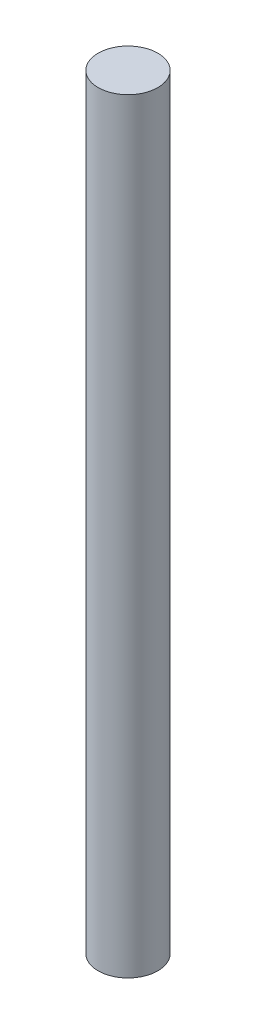
ISO-10303-21;
HEADER;
FILE_DESCRIPTION(('STEP AP214'),'2;1');
FILE_NAME('part.step','',(''),(''),'','','');
FILE_SCHEMA(('AUTOMOTIVE_DESIGN { 1 0 10303 214 1 1 1 1 }'));
ENDSEC;
DATA;
#1=APPLICATION_CONTEXT('core data for automotive mechanical design processes');
#2=APPLICATION_PROTOCOL_DEFINITION('international standard','automotive_design',2000,#1);
#3=PRODUCT_CONTEXT('',#1,'mechanical');
#4=PRODUCT('Part','Part','',(#3));
#5=PRODUCT_RELATED_PRODUCT_CATEGORY('part','',(#4));
#6=PRODUCT_DEFINITION_FORMATION('','',#4);
#7=PRODUCT_DEFINITION_CONTEXT('part definition',#1,'design');
#8=PRODUCT_DEFINITION('design','',#6,#7);
#9=PRODUCT_DEFINITION_SHAPE('','',#8);
#10=(LENGTH_UNIT() NAMED_UNIT(*) SI_UNIT(.MILLI.,.METRE.));
#11=(NAMED_UNIT(*) PLANE_ANGLE_UNIT() SI_UNIT($,.RADIAN.));
#12=(NAMED_UNIT(*) SI_UNIT($,.STERADIAN.) SOLID_ANGLE_UNIT());
#13=UNCERTAINTY_MEASURE_WITH_UNIT(LENGTH_MEASURE(1.E-05),#10,'distance_accuracy_value','');
#14=(GEOMETRIC_REPRESENTATION_CONTEXT(3) GLOBAL_UNCERTAINTY_ASSIGNED_CONTEXT((#13)) GLOBAL_UNIT_ASSIGNED_CONTEXT((#10,
#11,#12)) REPRESENTATION_CONTEXT('',''));
#15=CARTESIAN_POINT('',(0.,0.,0.));
#16=DIRECTION('',(0.,0.,1.));
#17=DIRECTION('',(1.,0.,0.));
#18=AXIS2_PLACEMENT_3D('',#15,#16,#17);
#19=CARTESIAN_POINT('',(1750.0000800792,-25025.,1750.00010455724));
#20=DIRECTION('',(0.,1.,0.));
#21=DIRECTION('',(0.,0.,1.));
#22=AXIS2_PLACEMENT_3D('',#19,#20,#21);
#23=CYLINDRICAL_SURFACE('',#22,1.95);
#24=CARTESIAN_POINT('',(1750.0000800792,-25025.,1750.00010455724));
#25=DIRECTION('',(0.,1.,0.));
#26=DIRECTION('',(0.,0.,1.));
#27=AXIS2_PLACEMENT_3D('',#24,#25,#26);
#28=CIRCLE('',#27,1.95);
#29=CARTESIAN_POINT('',(1750.0000800792,-25025.,1751.95010455724));
#30=VERTEX_POINT('',#29);
#31=EDGE_CURVE('E10',#30,#30,#28,.T.);
#32=ORIENTED_EDGE('',*,*,#31,.T.);
#33=EDGE_LOOP('',(#32));
#34=FACE_BOUND('',#33,.T.);
#35=CARTESIAN_POINT('',(1750.0000800792,-24975.,1750.00010455724));
#36=DIRECTION('',(0.,1.,0.));
#37=DIRECTION('',(0.,0.,1.));
#38=AXIS2_PLACEMENT_3D('',#35,#36,#37);
#39=CIRCLE('',#38,1.95);
#40=CARTESIAN_POINT('',(1750.0000800792,-24975.,1751.95010455724));
#41=VERTEX_POINT('',#40);
#42=EDGE_CURVE('E42',#41,#41,#39,.T.);
#43=ORIENTED_EDGE('',*,*,#42,.F.);
#44=EDGE_LOOP('',(#43));
#45=FACE_BOUND('',#44,.T.);
#46=ADVANCED_FACE('F39',(#34,#45),#23,.T.);
#47=CARTESIAN_POINT('',(1750.0000800792,-25025.,1750.00010455724));
#48=DIRECTION('',(0.,1.,0.));
#49=DIRECTION('',(0.,0.,1.));
#50=AXIS2_PLACEMENT_3D('',#47,#48,#49);
#51=PLANE('',#50);
#52=ORIENTED_EDGE('',*,*,#31,.F.);
#53=EDGE_LOOP('',(#52));
#54=FACE_BOUND('',#53,.T.);
#55=ADVANCED_FACE('F54',(#54),#51,.F.);
#56=CARTESIAN_POINT('',(1750.0000800792,-24975.,1750.00010455724));
#57=DIRECTION('',(0.,1.,0.));
#58=DIRECTION('',(0.,0.,1.));
#59=AXIS2_PLACEMENT_3D('',#56,#57,#58);
#60=PLANE('',#59);
#61=ORIENTED_EDGE('',*,*,#42,.T.);
#62=EDGE_LOOP('',(#61));
#63=FACE_BOUND('',#62,.T.);
#64=ADVANCED_FACE('F51',(#63),#60,.T.);
#65=CLOSED_SHELL('',(#46,#55,#64));
#66=MANIFOLD_SOLID_BREP('B2',#65);
#67=ADVANCED_BREP_SHAPE_REPRESENTATION('',(#18,#66),#14);
#68=SHAPE_DEFINITION_REPRESENTATION(#9,#67);
ENDSEC;
END-ISO-10303-21;
